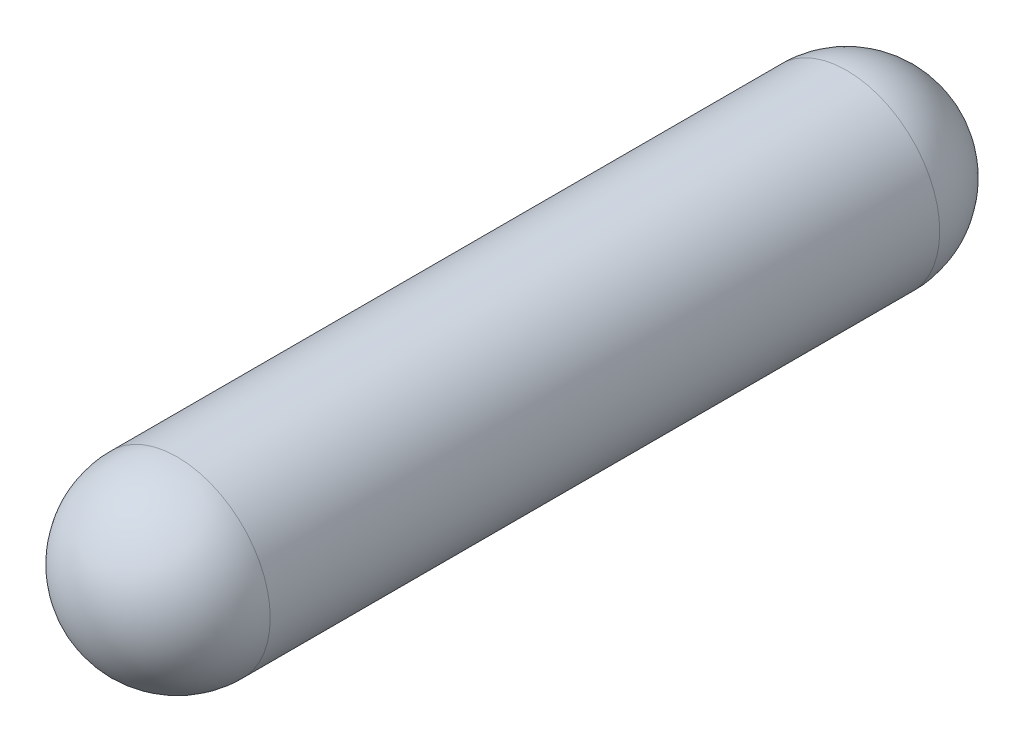
ISO-10303-21;
HEADER;
FILE_DESCRIPTION(('STEP AP214'),'2;1');
FILE_NAME('part.step','',(''),(''),'','','');
FILE_SCHEMA(('AUTOMOTIVE_DESIGN { 1 0 10303 214 1 1 1 1 }'));
ENDSEC;
DATA;
#1=APPLICATION_CONTEXT('core data for automotive mechanical design processes');
#2=APPLICATION_PROTOCOL_DEFINITION('international standard','automotive_design',2000,#1);
#3=PRODUCT_CONTEXT('',#1,'mechanical');
#4=PRODUCT('Part','Part','',(#3));
#5=PRODUCT_RELATED_PRODUCT_CATEGORY('part','',(#4));
#6=PRODUCT_DEFINITION_FORMATION('','',#4);
#7=PRODUCT_DEFINITION_CONTEXT('part definition',#1,'design');
#8=PRODUCT_DEFINITION('design','',#6,#7);
#9=PRODUCT_DEFINITION_SHAPE('','',#8);
#10=(LENGTH_UNIT() NAMED_UNIT(*) SI_UNIT(.MILLI.,.METRE.));
#11=(NAMED_UNIT(*) PLANE_ANGLE_UNIT() SI_UNIT($,.RADIAN.));
#12=(NAMED_UNIT(*) SI_UNIT($,.STERADIAN.) SOLID_ANGLE_UNIT());
#13=UNCERTAINTY_MEASURE_WITH_UNIT(LENGTH_MEASURE(1.E-05),#10,'distance_accuracy_value','');
#14=(GEOMETRIC_REPRESENTATION_CONTEXT(3) GLOBAL_UNCERTAINTY_ASSIGNED_CONTEXT((#13)) GLOBAL_UNIT_ASSIGNED_CONTEXT((#10,
#11,#12)) REPRESENTATION_CONTEXT('',''));
#15=CARTESIAN_POINT('',(0.,0.,0.));
#16=DIRECTION('',(0.,0.,1.));
#17=DIRECTION('',(1.,0.,0.));
#18=AXIS2_PLACEMENT_3D('',#15,#16,#17);
#19=CARTESIAN_POINT('',(0.,0.,-3.));
#20=DIRECTION('',(1.,0.,0.));
#21=DIRECTION('',(0.,-1.,0.));
#22=AXIS2_PLACEMENT_3D('',#19,#20,#21);
#23=SPHERICAL_SURFACE('',#22,1.25);
#24=CARTESIAN_POINT('',(0.,0.,-3.));
#25=DIRECTION('',(0.,0.,1.));
#26=DIRECTION('',(1.,0.,0.));
#27=AXIS2_PLACEMENT_3D('',#24,#25,#26);
#28=CIRCLE('',#27,1.25);
#29=CARTESIAN_POINT('',(1.25,0.,-3.));
#30=VERTEX_POINT('',#29);
#31=CARTESIAN_POINT('',(-1.25,0.,-3.));
#32=VERTEX_POINT('',#31);
#33=EDGE_CURVE('E42',#30,#32,#28,.T.);
#34=ORIENTED_EDGE('',*,*,#33,.F.);
#35=CARTESIAN_POINT('',(0.,0.,-3.));
#36=DIRECTION('',(0.,0.,1.));
#37=DIRECTION('',(1.,0.,0.));
#38=AXIS2_PLACEMENT_3D('',#35,#36,#37);
#39=CIRCLE('',#38,1.25);
#40=EDGE_CURVE('E26',#32,#30,#39,.T.);
#41=ORIENTED_EDGE('',*,*,#40,.F.);
#42=EDGE_LOOP('',(#34,#41));
#43=FACE_BOUND('',#42,.T.);
#44=ADVANCED_FACE('F17',(#43),#23,.T.);
#45=CARTESIAN_POINT('',(0.,0.,6.));
#46=DIRECTION('',(1.,0.,0.));
#47=DIRECTION('',(0.,1.,0.));
#48=AXIS2_PLACEMENT_3D('',#45,#46,#47);
#49=SPHERICAL_SURFACE('',#48,1.25);
#50=CARTESIAN_POINT('',(0.,0.,6.));
#51=DIRECTION('',(0.,0.,1.));
#52=DIRECTION('',(1.,0.,0.));
#53=AXIS2_PLACEMENT_3D('',#50,#51,#52);
#54=CIRCLE('',#53,1.25);
#55=CARTESIAN_POINT('',(1.25,0.,6.));
#56=VERTEX_POINT('',#55);
#57=CARTESIAN_POINT('',(-1.25,0.,6.));
#58=VERTEX_POINT('',#57);
#59=EDGE_CURVE('E11',#56,#58,#54,.F.);
#60=ORIENTED_EDGE('',*,*,#59,.F.);
#61=CARTESIAN_POINT('',(0.,0.,6.));
#62=DIRECTION('',(0.,0.,1.));
#63=DIRECTION('',(1.,0.,0.));
#64=AXIS2_PLACEMENT_3D('',#61,#62,#63);
#65=CIRCLE('',#64,1.25);
#66=EDGE_CURVE('E34',#58,#56,#65,.F.);
#67=ORIENTED_EDGE('',*,*,#66,.F.);
#68=EDGE_LOOP('',(#60,#67));
#69=FACE_BOUND('',#68,.T.);
#70=ADVANCED_FACE('F49',(#69),#49,.T.);
#71=CARTESIAN_POINT('',(0.,0.,-3.));
#72=DIRECTION('',(0.,0.,1.));
#73=DIRECTION('',(1.,0.,0.));
#74=AXIS2_PLACEMENT_3D('',#71,#72,#73);
#75=CYLINDRICAL_SURFACE('',#74,1.25);
#76=ORIENTED_EDGE('',*,*,#66,.T.);
#77=ORIENTED_EDGE('',*,*,#59,.T.);
#78=EDGE_LOOP('',(#76,#77));
#79=FACE_BOUND('',#78,.T.);
#80=ORIENTED_EDGE('',*,*,#40,.T.);
#81=ORIENTED_EDGE('',*,*,#33,.T.);
#82=EDGE_LOOP('',(#80,#81));
#83=FACE_BOUND('',#82,.T.);
#84=ADVANCED_FACE('F45',(#79,#83),#75,.T.);
#85=CLOSED_SHELL('',(#44,#70,#84));
#86=MANIFOLD_SOLID_BREP('B1',#85);
#87=ADVANCED_BREP_SHAPE_REPRESENTATION('',(#18,#86),#14);
#88=SHAPE_DEFINITION_REPRESENTATION(#9,#87);
ENDSEC;
END-ISO-10303-21;
